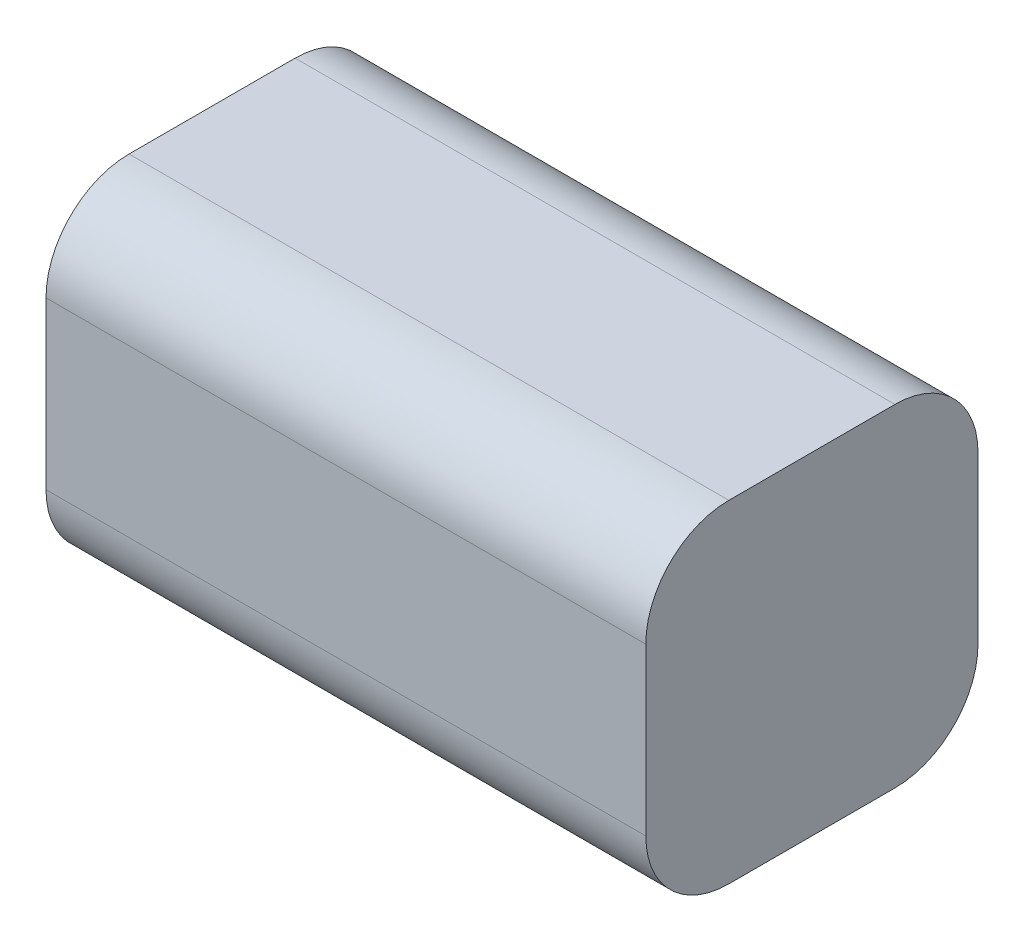
ISO-10303-21;
HEADER;
FILE_DESCRIPTION(('STEP AP214'),'2;1');
FILE_NAME('part.step','',(''),(''),'','','');
FILE_SCHEMA(('AUTOMOTIVE_DESIGN { 1 0 10303 214 1 1 1 1 }'));
ENDSEC;
DATA;
#1=APPLICATION_CONTEXT('core data for automotive mechanical design processes');
#2=APPLICATION_PROTOCOL_DEFINITION('international standard','automotive_design',2000,#1);
#3=PRODUCT_CONTEXT('',#1,'mechanical');
#4=PRODUCT('Part','Part','',(#3));
#5=PRODUCT_RELATED_PRODUCT_CATEGORY('part','',(#4));
#6=PRODUCT_DEFINITION_FORMATION('','',#4);
#7=PRODUCT_DEFINITION_CONTEXT('part definition',#1,'design');
#8=PRODUCT_DEFINITION('design','',#6,#7);
#9=PRODUCT_DEFINITION_SHAPE('','',#8);
#10=(LENGTH_UNIT() NAMED_UNIT(*) SI_UNIT(.MILLI.,.METRE.));
#11=(NAMED_UNIT(*) PLANE_ANGLE_UNIT() SI_UNIT($,.RADIAN.));
#12=(NAMED_UNIT(*) SI_UNIT($,.STERADIAN.) SOLID_ANGLE_UNIT());
#13=UNCERTAINTY_MEASURE_WITH_UNIT(LENGTH_MEASURE(1.E-05),#10,'distance_accuracy_value','');
#14=(GEOMETRIC_REPRESENTATION_CONTEXT(3) GLOBAL_UNCERTAINTY_ASSIGNED_CONTEXT((#13)) GLOBAL_UNIT_ASSIGNED_CONTEXT((#10,
#11,#12)) REPRESENTATION_CONTEXT('',''));
#15=CARTESIAN_POINT('',(0.,0.,0.));
#16=DIRECTION('',(0.,0.,1.));
#17=DIRECTION('',(1.,0.,0.));
#18=AXIS2_PLACEMENT_3D('',#15,#16,#17);
#19=CARTESIAN_POINT('',(32.5,18.,18.));
#20=DIRECTION('',(-1.,0.,0.));
#21=DIRECTION('',(0.,0.,1.));
#22=AXIS2_PLACEMENT_3D('',#19,#20,#21);
#23=PLANE('',#22);
#24=DIRECTION('',(0.,0.,-1.));
#25=VECTOR('',#24,1.);
#26=CARTESIAN_POINT('',(32.5,-18.,18.));
#27=LINE('',#26,#25);
#28=CARTESIAN_POINT('',(32.5,-18.,9.00000000000002));
#29=VERTEX_POINT('',#28);
#30=CARTESIAN_POINT('',(32.5,-18.,-9.00000000000001));
#31=VERTEX_POINT('',#30);
#32=EDGE_CURVE('E195',#29,#31,#27,.T.);
#33=ORIENTED_EDGE('',*,*,#32,.T.);
#34=CARTESIAN_POINT('',(32.5,-9.,-9.00000000000002));
#35=DIRECTION('',(-1.,0.,0.));
#36=DIRECTION('',(0.,0.,1.));
#37=AXIS2_PLACEMENT_3D('',#34,#35,#36);
#38=CIRCLE('',#37,9.);
#39=CARTESIAN_POINT('',(32.5,-9.,-18.));
#40=VERTEX_POINT('',#39);
#41=EDGE_CURVE('E161',#31,#40,#38,.F.);
#42=ORIENTED_EDGE('',*,*,#41,.T.);
#43=DIRECTION('',(0.,-1.,0.));
#44=VECTOR('',#43,1.);
#45=CARTESIAN_POINT('',(32.5,18.,-18.));
#46=LINE('',#45,#44);
#47=CARTESIAN_POINT('',(32.5,9.,-18.));
#48=VERTEX_POINT('',#47);
#49=EDGE_CURVE('E129',#48,#40,#46,.T.);
#50=ORIENTED_EDGE('',*,*,#49,.F.);
#51=CARTESIAN_POINT('',(32.5,9.,-9.00000000000002));
#52=DIRECTION('',(-1.,0.,0.));
#53=DIRECTION('',(0.,0.,1.));
#54=AXIS2_PLACEMENT_3D('',#51,#52,#53);
#55=CIRCLE('',#54,9.);
#56=CARTESIAN_POINT('',(32.5,18.,-9.00000000000001));
#57=VERTEX_POINT('',#56);
#58=EDGE_CURVE('E134',#48,#57,#55,.F.);
#59=ORIENTED_EDGE('',*,*,#58,.T.);
#60=DIRECTION('',(0.,0.,-1.));
#61=VECTOR('',#60,1.);
#62=CARTESIAN_POINT('',(32.5,18.,18.));
#63=LINE('',#62,#61);
#64=CARTESIAN_POINT('',(32.5,18.,9.00000000000002));
#65=VERTEX_POINT('',#64);
#66=EDGE_CURVE('E187',#65,#57,#63,.T.);
#67=ORIENTED_EDGE('',*,*,#66,.F.);
#68=CARTESIAN_POINT('',(32.5,9.,9.00000000000002));
#69=DIRECTION('',(-1.,0.,0.));
#70=DIRECTION('',(0.,0.,1.));
#71=AXIS2_PLACEMENT_3D('',#68,#69,#70);
#72=CIRCLE('',#71,9.);
#73=CARTESIAN_POINT('',(32.5,9.,18.));
#74=VERTEX_POINT('',#73);
#75=EDGE_CURVE('E62',#65,#74,#72,.F.);
#76=ORIENTED_EDGE('',*,*,#75,.T.);
#77=DIRECTION('',(0.,-1.,0.));
#78=VECTOR('',#77,1.);
#79=CARTESIAN_POINT('',(32.5,18.,18.));
#80=LINE('',#79,#78);
#81=CARTESIAN_POINT('',(32.5,-9.,18.));
#82=VERTEX_POINT('',#81);
#83=EDGE_CURVE('E176',#74,#82,#80,.T.);
#84=ORIENTED_EDGE('',*,*,#83,.T.);
#85=CARTESIAN_POINT('',(32.5,-9.,9.00000000000002));
#86=DIRECTION('',(-1.,0.,0.));
#87=DIRECTION('',(0.,0.,1.));
#88=AXIS2_PLACEMENT_3D('',#85,#86,#87);
#89=CIRCLE('',#88,9.);
#90=EDGE_CURVE('E55',#82,#29,#89,.F.);
#91=ORIENTED_EDGE('',*,*,#90,.T.);
#92=EDGE_LOOP('',(#33,#42,#50,#59,#67,#76,#84,#91));
#93=FACE_BOUND('',#92,.T.);
#94=ADVANCED_FACE('F39',(#93),#23,.F.);
#95=CARTESIAN_POINT('',(-32.5,18.,-18.));
#96=DIRECTION('',(0.,0.,1.));
#97=DIRECTION('',(1.,0.,0.));
#98=AXIS2_PLACEMENT_3D('',#95,#96,#97);
#99=PLANE('',#98);
#100=ORIENTED_EDGE('',*,*,#49,.T.);
#101=DIRECTION('',(-1.,0.,0.));
#102=VECTOR('',#101,1.);
#103=CARTESIAN_POINT('',(-32.5,-9.,-18.));
#104=LINE('',#103,#102);
#105=CARTESIAN_POINT('',(-32.5,-9.,-18.));
#106=VERTEX_POINT('',#105);
#107=EDGE_CURVE('E127',#40,#106,#104,.T.);
#108=ORIENTED_EDGE('',*,*,#107,.T.);
#109=DIRECTION('',(0.,-1.,0.));
#110=VECTOR('',#109,1.);
#111=CARTESIAN_POINT('',(-32.5,18.,-18.));
#112=LINE('',#111,#110);
#113=CARTESIAN_POINT('',(-32.5,9.,-18.));
#114=VERTEX_POINT('',#113);
#115=EDGE_CURVE('E109',#114,#106,#112,.T.);
#116=ORIENTED_EDGE('',*,*,#115,.F.);
#117=DIRECTION('',(-1.,0.,0.));
#118=VECTOR('',#117,1.);
#119=CARTESIAN_POINT('',(-32.5,9.,-18.));
#120=LINE('',#119,#118);
#121=EDGE_CURVE('E124',#114,#48,#120,.F.);
#122=ORIENTED_EDGE('',*,*,#121,.T.);
#123=EDGE_LOOP('',(#100,#108,#116,#122));
#124=FACE_BOUND('',#123,.T.);
#125=ADVANCED_FACE('F123',(#124),#99,.F.);
#126=CARTESIAN_POINT('',(-32.5,18.,18.));
#127=DIRECTION('',(1.,0.,0.));
#128=DIRECTION('',(0.,0.,-1.));
#129=AXIS2_PLACEMENT_3D('',#126,#127,#128);
#130=PLANE('',#129);
#131=ORIENTED_EDGE('',*,*,#115,.T.);
#132=CARTESIAN_POINT('',(-32.5,-9.,-9.00000000000002));
#133=DIRECTION('',(1.,0.,0.));
#134=DIRECTION('',(0.,0.,-1.));
#135=AXIS2_PLACEMENT_3D('',#132,#133,#134);
#136=CIRCLE('',#135,9.);
#137=CARTESIAN_POINT('',(-32.5,-18.,-9.00000000000001));
#138=VERTEX_POINT('',#137);
#139=EDGE_CURVE('E117',#106,#138,#136,.F.);
#140=ORIENTED_EDGE('',*,*,#139,.T.);
#141=DIRECTION('',(0.,0.,1.));
#142=VECTOR('',#141,1.);
#143=CARTESIAN_POINT('',(-32.5,-18.,18.));
#144=LINE('',#143,#142);
#145=CARTESIAN_POINT('',(-32.5,-18.,9.00000000000002));
#146=VERTEX_POINT('',#145);
#147=EDGE_CURVE('E190',#138,#146,#144,.T.);
#148=ORIENTED_EDGE('',*,*,#147,.T.);
#149=CARTESIAN_POINT('',(-32.5,-9.,9.00000000000002));
#150=DIRECTION('',(1.,0.,0.));
#151=DIRECTION('',(0.,0.,-1.));
#152=AXIS2_PLACEMENT_3D('',#149,#150,#151);
#153=CIRCLE('',#152,9.);
#154=CARTESIAN_POINT('',(-32.5,-9.,18.));
#155=VERTEX_POINT('',#154);
#156=EDGE_CURVE('E118',#146,#155,#153,.F.);
#157=ORIENTED_EDGE('',*,*,#156,.T.);
#158=DIRECTION('',(0.,-1.,0.));
#159=VECTOR('',#158,1.);
#160=CARTESIAN_POINT('',(-32.5,18.,18.));
#161=LINE('',#160,#159);
#162=CARTESIAN_POINT('',(-32.5,9.,18.));
#163=VERTEX_POINT('',#162);
#164=EDGE_CURVE('E130',#163,#155,#161,.T.);
#165=ORIENTED_EDGE('',*,*,#164,.F.);
#166=CARTESIAN_POINT('',(-32.5,9.,9.00000000000002));
#167=DIRECTION('',(1.,0.,0.));
#168=DIRECTION('',(0.,0.,-1.));
#169=AXIS2_PLACEMENT_3D('',#166,#167,#168);
#170=CIRCLE('',#169,9.);
#171=CARTESIAN_POINT('',(-32.5,18.,9.00000000000002));
#172=VERTEX_POINT('',#171);
#173=EDGE_CURVE('E139',#163,#172,#170,.F.);
#174=ORIENTED_EDGE('',*,*,#173,.T.);
#175=DIRECTION('',(0.,0.,1.));
#176=VECTOR('',#175,1.);
#177=CARTESIAN_POINT('',(-32.5,18.,18.));
#178=LINE('',#177,#176);
#179=CARTESIAN_POINT('',(-32.5,18.,-9.00000000000001));
#180=VERTEX_POINT('',#179);
#181=EDGE_CURVE('E111',#180,#172,#178,.T.);
#182=ORIENTED_EDGE('',*,*,#181,.F.);
#183=CARTESIAN_POINT('',(-32.5,9.,-9.00000000000002));
#184=DIRECTION('',(1.,0.,0.));
#185=DIRECTION('',(0.,0.,-1.));
#186=AXIS2_PLACEMENT_3D('',#183,#184,#185);
#187=CIRCLE('',#186,9.);
#188=EDGE_CURVE('E106',#180,#114,#187,.F.);
#189=ORIENTED_EDGE('',*,*,#188,.T.);
#190=EDGE_LOOP('',(#131,#140,#148,#157,#165,#174,#182,#189));
#191=FACE_BOUND('',#190,.T.);
#192=ADVANCED_FACE('F108',(#191),#130,.F.);
#193=CARTESIAN_POINT('',(-32.5,18.,18.));
#194=DIRECTION('',(0.,0.,-1.));
#195=DIRECTION('',(-1.,0.,0.));
#196=AXIS2_PLACEMENT_3D('',#193,#194,#195);
#197=PLANE('',#196);
#198=ORIENTED_EDGE('',*,*,#164,.T.);
#199=DIRECTION('',(1.,0.,0.));
#200=VECTOR('',#199,1.);
#201=CARTESIAN_POINT('',(32.5,-9.,18.));
#202=LINE('',#201,#200);
#203=EDGE_CURVE('E11',#155,#82,#202,.T.);
#204=ORIENTED_EDGE('',*,*,#203,.T.);
#205=ORIENTED_EDGE('',*,*,#83,.F.);
#206=DIRECTION('',(1.,0.,0.));
#207=VECTOR('',#206,1.);
#208=CARTESIAN_POINT('',(-32.5,9.,18.));
#209=LINE('',#208,#207);
#210=EDGE_CURVE('E48',#74,#163,#209,.F.);
#211=ORIENTED_EDGE('',*,*,#210,.T.);
#212=EDGE_LOOP('',(#198,#204,#205,#211));
#213=FACE_BOUND('',#212,.T.);
#214=ADVANCED_FACE('F175',(#213),#197,.F.);
#215=CARTESIAN_POINT('',(0.,18.,0.));
#216=DIRECTION('',(0.,-1.,0.));
#217=DIRECTION('',(0.,0.,-1.));
#218=AXIS2_PLACEMENT_3D('',#215,#216,#217);
#219=PLANE('',#218);
#220=ORIENTED_EDGE('',*,*,#66,.T.);
#221=DIRECTION('',(-1.,0.,0.));
#222=VECTOR('',#221,1.);
#223=CARTESIAN_POINT('',(0.,18.,-9.00000000000002));
#224=LINE('',#223,#222);
#225=EDGE_CURVE('E168',#57,#180,#224,.T.);
#226=ORIENTED_EDGE('',*,*,#225,.T.);
#227=ORIENTED_EDGE('',*,*,#181,.T.);
#228=DIRECTION('',(1.,0.,0.));
#229=VECTOR('',#228,1.);
#230=CARTESIAN_POINT('',(0.,18.,9.00000000000002));
#231=LINE('',#230,#229);
#232=EDGE_CURVE('E164',#172,#65,#231,.T.);
#233=ORIENTED_EDGE('',*,*,#232,.T.);
#234=EDGE_LOOP('',(#220,#226,#227,#233));
#235=FACE_BOUND('',#234,.T.);
#236=ADVANCED_FACE('F186',(#235),#219,.F.);
#237=CARTESIAN_POINT('',(0.,-18.,0.));
#238=DIRECTION('',(0.,-1.,0.));
#239=DIRECTION('',(0.,0.,-1.));
#240=AXIS2_PLACEMENT_3D('',#237,#238,#239);
#241=PLANE('',#240);
#242=ORIENTED_EDGE('',*,*,#147,.F.);
#243=DIRECTION('',(-1.,0.,0.));
#244=VECTOR('',#243,1.);
#245=CARTESIAN_POINT('',(32.5,-18.,-9.00000000000002));
#246=LINE('',#245,#244);
#247=EDGE_CURVE('E152',#138,#31,#246,.F.);
#248=ORIENTED_EDGE('',*,*,#247,.T.);
#249=ORIENTED_EDGE('',*,*,#32,.F.);
#250=DIRECTION('',(1.,0.,0.));
#251=VECTOR('',#250,1.);
#252=CARTESIAN_POINT('',(-32.5,-18.,9.00000000000002));
#253=LINE('',#252,#251);
#254=EDGE_CURVE('E149',#29,#146,#253,.F.);
#255=ORIENTED_EDGE('',*,*,#254,.T.);
#256=EDGE_LOOP('',(#242,#248,#249,#255));
#257=FACE_BOUND('',#256,.T.);
#258=ADVANCED_FACE('F205',(#257),#241,.T.);
#259=CARTESIAN_POINT('',(-32.5,-9.,-9.00000000000002));
#260=DIRECTION('',(1.,0.,0.));
#261=DIRECTION('',(0.,0.,-1.));
#262=AXIS2_PLACEMENT_3D('',#259,#260,#261);
#263=CYLINDRICAL_SURFACE('',#262,9.);
#264=ORIENTED_EDGE('',*,*,#41,.F.);
#265=ORIENTED_EDGE('',*,*,#247,.F.);
#266=ORIENTED_EDGE('',*,*,#139,.F.);
#267=ORIENTED_EDGE('',*,*,#107,.F.);
#268=EDGE_LOOP('',(#264,#265,#266,#267));
#269=FACE_BOUND('',#268,.T.);
#270=ADVANCED_FACE('F213',(#269),#263,.T.);
#271=CARTESIAN_POINT('',(0.,9.,-9.00000000000002));
#272=DIRECTION('',(-1.,0.,0.));
#273=DIRECTION('',(0.,0.,1.));
#274=AXIS2_PLACEMENT_3D('',#271,#272,#273);
#275=CYLINDRICAL_SURFACE('',#274,9.);
#276=ORIENTED_EDGE('',*,*,#58,.F.);
#277=ORIENTED_EDGE('',*,*,#121,.F.);
#278=ORIENTED_EDGE('',*,*,#188,.F.);
#279=ORIENTED_EDGE('',*,*,#225,.F.);
#280=EDGE_LOOP('',(#276,#277,#278,#279));
#281=FACE_BOUND('',#280,.T.);
#282=ADVANCED_FACE('F133',(#281),#275,.T.);
#283=CARTESIAN_POINT('',(-32.5,-9.,9.00000000000002));
#284=DIRECTION('',(-1.,0.,0.));
#285=DIRECTION('',(0.,0.,1.));
#286=AXIS2_PLACEMENT_3D('',#283,#284,#285);
#287=CYLINDRICAL_SURFACE('',#286,9.);
#288=ORIENTED_EDGE('',*,*,#156,.F.);
#289=ORIENTED_EDGE('',*,*,#254,.F.);
#290=ORIENTED_EDGE('',*,*,#90,.F.);
#291=ORIENTED_EDGE('',*,*,#203,.F.);
#292=EDGE_LOOP('',(#288,#289,#290,#291));
#293=FACE_BOUND('',#292,.T.);
#294=ADVANCED_FACE('F207',(#293),#287,.T.);
#295=CARTESIAN_POINT('',(0.,9.,9.00000000000002));
#296=DIRECTION('',(1.,0.,0.));
#297=DIRECTION('',(0.,0.,-1.));
#298=AXIS2_PLACEMENT_3D('',#295,#296,#297);
#299=CYLINDRICAL_SURFACE('',#298,9.);
#300=ORIENTED_EDGE('',*,*,#173,.F.);
#301=ORIENTED_EDGE('',*,*,#210,.F.);
#302=ORIENTED_EDGE('',*,*,#75,.F.);
#303=ORIENTED_EDGE('',*,*,#232,.F.);
#304=EDGE_LOOP('',(#300,#301,#302,#303));
#305=FACE_BOUND('',#304,.T.);
#306=ADVANCED_FACE('F41',(#305),#299,.T.);
#307=CLOSED_SHELL('',(#94,#125,#192,#214,#236,#258,#270,#282,#294,#306));
#308=MANIFOLD_SOLID_BREP('B2',#307);
#309=ADVANCED_BREP_SHAPE_REPRESENTATION('',(#18,#308),#14);
#310=SHAPE_DEFINITION_REPRESENTATION(#9,#309);
ENDSEC;
END-ISO-10303-21;
